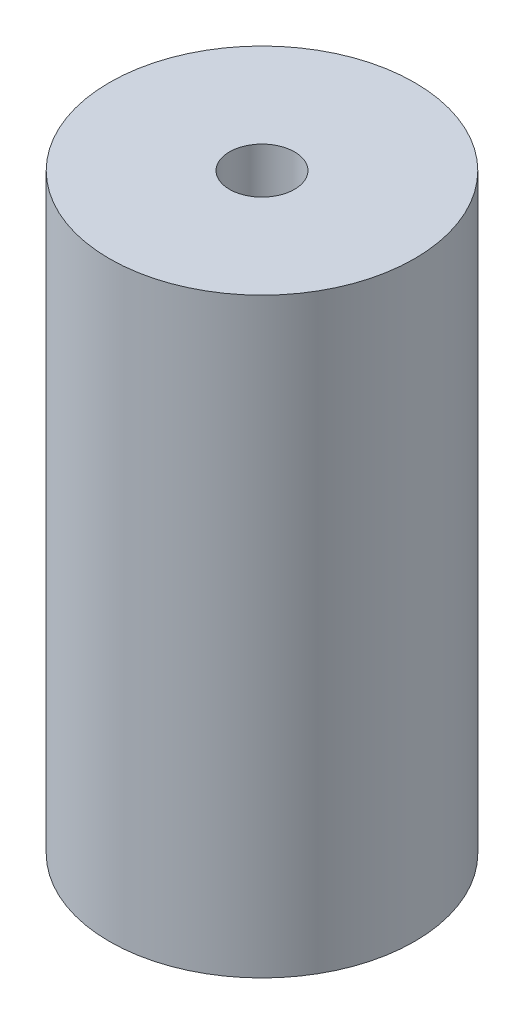
ISO-10303-21;
HEADER;
FILE_DESCRIPTION(('STEP AP214'),'2;1');
FILE_NAME('part.step','',(''),(''),'','','');
FILE_SCHEMA(('AUTOMOTIVE_DESIGN { 1 0 10303 214 1 1 1 1 }'));
ENDSEC;
DATA;
#1=APPLICATION_CONTEXT('core data for automotive mechanical design processes');
#2=APPLICATION_PROTOCOL_DEFINITION('international standard','automotive_design',2000,#1);
#3=PRODUCT_CONTEXT('',#1,'mechanical');
#4=PRODUCT('Part','Part','',(#3));
#5=PRODUCT_RELATED_PRODUCT_CATEGORY('part','',(#4));
#6=PRODUCT_DEFINITION_FORMATION('','',#4);
#7=PRODUCT_DEFINITION_CONTEXT('part definition',#1,'design');
#8=PRODUCT_DEFINITION('design','',#6,#7);
#9=PRODUCT_DEFINITION_SHAPE('','',#8);
#10=(LENGTH_UNIT() NAMED_UNIT(*) SI_UNIT(.MILLI.,.METRE.));
#11=(NAMED_UNIT(*) PLANE_ANGLE_UNIT() SI_UNIT($,.RADIAN.));
#12=(NAMED_UNIT(*) SI_UNIT($,.STERADIAN.) SOLID_ANGLE_UNIT());
#13=UNCERTAINTY_MEASURE_WITH_UNIT(LENGTH_MEASURE(1.E-05),#10,'distance_accuracy_value','');
#14=(GEOMETRIC_REPRESENTATION_CONTEXT(3) GLOBAL_UNCERTAINTY_ASSIGNED_CONTEXT((#13)) GLOBAL_UNIT_ASSIGNED_CONTEXT((#10,
#11,#12)) REPRESENTATION_CONTEXT('',''));
#15=CARTESIAN_POINT('',(0.,0.,0.));
#16=DIRECTION('',(0.,0.,1.));
#17=DIRECTION('',(1.,0.,0.));
#18=AXIS2_PLACEMENT_3D('',#15,#16,#17);
#19=CARTESIAN_POINT('',(0.,150.,0.));
#20=DIRECTION('',(0.,1.,0.));
#21=DIRECTION('',(0.,0.,1.));
#22=AXIS2_PLACEMENT_3D('',#19,#20,#21);
#23=PLANE('',#22);
#24=CARTESIAN_POINT('',(0.,150.,0.));
#25=DIRECTION('',(0.,1.,0.));
#26=DIRECTION('',(0.,0.,1.));
#27=AXIS2_PLACEMENT_3D('',#24,#25,#26);
#28=CIRCLE('',#27,38.71);
#29=CARTESIAN_POINT('',(0.,150.,38.71));
#30=VERTEX_POINT('',#29);
#31=EDGE_CURVE('E10',#30,#30,#28,.T.);
#32=ORIENTED_EDGE('',*,*,#31,.T.);
#33=EDGE_LOOP('',(#32));
#34=FACE_BOUND('',#33,.T.);
#35=CARTESIAN_POINT('',(0.,150.,0.));
#36=DIRECTION('',(0.,1.,0.));
#37=DIRECTION('',(0.,0.,1.));
#38=AXIS2_PLACEMENT_3D('',#35,#36,#37);
#39=CIRCLE('',#38,8.25);
#40=CARTESIAN_POINT('',(0.,150.,8.25));
#41=VERTEX_POINT('',#40);
#42=EDGE_CURVE('E50',#41,#41,#39,.T.);
#43=ORIENTED_EDGE('',*,*,#42,.F.);
#44=EDGE_LOOP('',(#43));
#45=FACE_BOUND('',#44,.T.);
#46=ADVANCED_FACE('F39',(#34,#45),#23,.T.);
#47=CARTESIAN_POINT('',(0.,0.,0.));
#48=DIRECTION('',(0.,1.,0.));
#49=DIRECTION('',(0.,0.,1.));
#50=AXIS2_PLACEMENT_3D('',#47,#48,#49);
#51=PLANE('',#50);
#52=CARTESIAN_POINT('',(0.,0.,0.));
#53=DIRECTION('',(0.,1.,0.));
#54=DIRECTION('',(0.,0.,1.));
#55=AXIS2_PLACEMENT_3D('',#52,#53,#54);
#56=CIRCLE('',#55,38.71);
#57=CARTESIAN_POINT('',(0.,0.,38.71));
#58=VERTEX_POINT('',#57);
#59=EDGE_CURVE('E43',#58,#58,#56,.T.);
#60=ORIENTED_EDGE('',*,*,#59,.F.);
#61=EDGE_LOOP('',(#60));
#62=FACE_BOUND('',#61,.T.);
#63=CARTESIAN_POINT('',(0.,0.,0.));
#64=DIRECTION('',(0.,1.,0.));
#65=DIRECTION('',(0.,0.,1.));
#66=AXIS2_PLACEMENT_3D('',#63,#64,#65);
#67=CIRCLE('',#66,8.25);
#68=CARTESIAN_POINT('',(0.,0.,8.25));
#69=VERTEX_POINT('',#68);
#70=EDGE_CURVE('E52',#69,#69,#67,.T.);
#71=ORIENTED_EDGE('',*,*,#70,.T.);
#72=EDGE_LOOP('',(#71));
#73=FACE_BOUND('',#72,.T.);
#74=ADVANCED_FACE('F62',(#62,#73),#51,.F.);
#75=CARTESIAN_POINT('',(0.,150.,0.));
#76=DIRECTION('',(0.,-1.,0.));
#77=DIRECTION('',(0.,0.,-1.));
#78=AXIS2_PLACEMENT_3D('',#75,#76,#77);
#79=CYLINDRICAL_SURFACE('',#78,38.71);
#80=ORIENTED_EDGE('',*,*,#31,.F.);
#81=EDGE_LOOP('',(#80));
#82=FACE_BOUND('',#81,.T.);
#83=ORIENTED_EDGE('',*,*,#59,.T.);
#84=EDGE_LOOP('',(#83));
#85=FACE_BOUND('',#84,.T.);
#86=ADVANCED_FACE('F41',(#82,#85),#79,.T.);
#87=CARTESIAN_POINT('',(0.,150.,0.));
#88=DIRECTION('',(0.,-1.,0.));
#89=DIRECTION('',(0.,0.,-1.));
#90=AXIS2_PLACEMENT_3D('',#87,#88,#89);
#91=CYLINDRICAL_SURFACE('',#90,8.25);
#92=ORIENTED_EDGE('',*,*,#42,.T.);
#93=EDGE_LOOP('',(#92));
#94=FACE_BOUND('',#93,.T.);
#95=ORIENTED_EDGE('',*,*,#70,.F.);
#96=EDGE_LOOP('',(#95));
#97=FACE_BOUND('',#96,.T.);
#98=ADVANCED_FACE('F58',(#94,#97),#91,.F.);
#99=CLOSED_SHELL('',(#46,#74,#86,#98));
#100=MANIFOLD_SOLID_BREP('B2',#99);
#101=ADVANCED_BREP_SHAPE_REPRESENTATION('',(#18,#100),#14);
#102=SHAPE_DEFINITION_REPRESENTATION(#9,#101);
ENDSEC;
END-ISO-10303-21;
